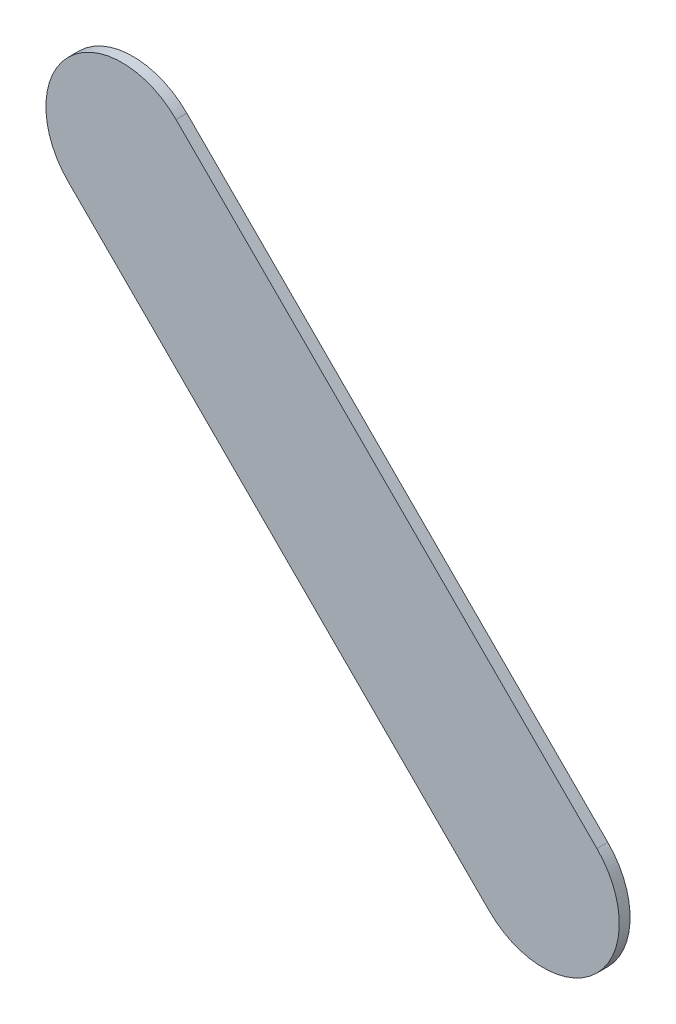
ISO-10303-21;
HEADER;
FILE_DESCRIPTION(('STEP AP214'),'2;1');
FILE_NAME('part.step','',(''),(''),'','','');
FILE_SCHEMA(('AUTOMOTIVE_DESIGN { 1 0 10303 214 1 1 1 1 }'));
ENDSEC;
DATA;
#1=APPLICATION_CONTEXT('core data for automotive mechanical design processes');
#2=APPLICATION_PROTOCOL_DEFINITION('international standard','automotive_design',2000,#1);
#3=PRODUCT_CONTEXT('',#1,'mechanical');
#4=PRODUCT('Part','Part','',(#3));
#5=PRODUCT_RELATED_PRODUCT_CATEGORY('part','',(#4));
#6=PRODUCT_DEFINITION_FORMATION('','',#4);
#7=PRODUCT_DEFINITION_CONTEXT('part definition',#1,'design');
#8=PRODUCT_DEFINITION('design','',#6,#7);
#9=PRODUCT_DEFINITION_SHAPE('','',#8);
#10=(LENGTH_UNIT() NAMED_UNIT(*) SI_UNIT(.MILLI.,.METRE.));
#11=(NAMED_UNIT(*) PLANE_ANGLE_UNIT() SI_UNIT($,.RADIAN.));
#12=(NAMED_UNIT(*) SI_UNIT($,.STERADIAN.) SOLID_ANGLE_UNIT());
#13=UNCERTAINTY_MEASURE_WITH_UNIT(LENGTH_MEASURE(1.E-05),#10,'distance_accuracy_value','');
#14=(GEOMETRIC_REPRESENTATION_CONTEXT(3) GLOBAL_UNCERTAINTY_ASSIGNED_CONTEXT((#13)) GLOBAL_UNIT_ASSIGNED_CONTEXT((#10,
#11,#12)) REPRESENTATION_CONTEXT('',''));
#15=CARTESIAN_POINT('',(0.,0.,0.));
#16=DIRECTION('',(0.,0.,1.));
#17=DIRECTION('',(1.,0.,0.));
#18=AXIS2_PLACEMENT_3D('',#15,#16,#17);
#19=CARTESIAN_POINT('',(51.10121352,107.94523496,0.));
#20=DIRECTION('',(0.707106781186538,0.707106781186557,0.));
#21=DIRECTION('',(0.707106781186557,-0.707106781186538,0.));
#22=AXIS2_PLACEMENT_3D('',#19,#20,#21);
#23=PLANE('',#22);
#24=DIRECTION('',(0.707106781186557,-0.707106781186538,0.));
#25=VECTOR('',#24,1.);
#26=CARTESIAN_POINT('',(51.10121352,107.94523496,0.03556));
#27=LINE('',#26,#25);
#28=CARTESIAN_POINT('',(51.10121352,107.94523496,0.03556));
#29=VERTEX_POINT('',#28);
#30=CARTESIAN_POINT('',(52.48222676,106.56422172,0.03556));
#31=VERTEX_POINT('',#30);
#32=EDGE_CURVE('E11',#29,#31,#27,.T.);
#33=ORIENTED_EDGE('',*,*,#32,.F.);
#34=DIRECTION('',(0.,0.,1.));
#35=VECTOR('',#34,1.);
#36=CARTESIAN_POINT('',(51.10121352,107.94523496,0.));
#37=LINE('',#36,#35);
#38=CARTESIAN_POINT('',(51.10121352,107.94523496,0.));
#39=VERTEX_POINT('',#38);
#40=EDGE_CURVE('E24',#39,#29,#37,.T.);
#41=ORIENTED_EDGE('',*,*,#40,.F.);
#42=DIRECTION('',(0.707106781186557,-0.707106781186538,0.));
#43=VECTOR('',#42,1.);
#44=CARTESIAN_POINT('',(51.10121352,107.94523496,0.));
#45=LINE('',#44,#43);
#46=CARTESIAN_POINT('',(52.48222676,106.56422172,0.));
#47=VERTEX_POINT('',#46);
#48=EDGE_CURVE('E75',#39,#47,#45,.T.);
#49=ORIENTED_EDGE('',*,*,#48,.T.);
#50=DIRECTION('',(0.,0.,1.));
#51=VECTOR('',#50,1.);
#52=CARTESIAN_POINT('',(52.48222676,106.56422172,0.));
#53=LINE('',#52,#51);
#54=EDGE_CURVE('E37',#47,#31,#53,.T.);
#55=ORIENTED_EDGE('',*,*,#54,.T.);
#56=EDGE_LOOP('',(#33,#41,#49,#55));
#57=FACE_BOUND('',#56,.T.);
#58=ADVANCED_FACE('F17',(#57),#23,.F.);
#59=CARTESIAN_POINT('',(52.65900314,106.7409981,0.));
#60=DIRECTION('',(0.,0.,-1.));
#61=DIRECTION('',(-0.707106781186519,-0.707106781186576,0.));
#62=AXIS2_PLACEMENT_3D('',#59,#60,#61);
#63=CYLINDRICAL_SURFACE('',#62,0.24999955410322);
#64=CARTESIAN_POINT('',(52.65900314,106.7409981,0.03556));
#65=DIRECTION('',(0.,0.,1.));
#66=DIRECTION('',(-0.707106781186519,-0.707106781186576,0.));
#67=AXIS2_PLACEMENT_3D('',#64,#65,#66);
#68=CIRCLE('',#67,0.24999955410322);
#69=CARTESIAN_POINT('',(52.83577952,106.91777448,0.03556));
#70=VERTEX_POINT('',#69);
#71=EDGE_CURVE('E83',#31,#70,#68,.T.);
#72=ORIENTED_EDGE('',*,*,#71,.F.);
#73=ORIENTED_EDGE('',*,*,#54,.F.);
#74=CARTESIAN_POINT('',(52.65900314,106.7409981,0.));
#75=DIRECTION('',(0.,0.,1.));
#76=DIRECTION('',(-0.707106781186519,-0.707106781186576,0.));
#77=AXIS2_PLACEMENT_3D('',#74,#75,#76);
#78=CIRCLE('',#77,0.24999955410322);
#79=CARTESIAN_POINT('',(52.83577952,106.91777448,0.));
#80=VERTEX_POINT('',#79);
#81=EDGE_CURVE('E81',#47,#80,#78,.T.);
#82=ORIENTED_EDGE('',*,*,#81,.T.);
#83=DIRECTION('',(0.,0.,1.));
#84=VECTOR('',#83,1.);
#85=CARTESIAN_POINT('',(52.83577952,106.91777448,0.));
#86=LINE('',#85,#84);
#87=EDGE_CURVE('E67',#80,#70,#86,.T.);
#88=ORIENTED_EDGE('',*,*,#87,.T.);
#89=EDGE_LOOP('',(#72,#73,#82,#88));
#90=FACE_BOUND('',#89,.T.);
#91=ADVANCED_FACE('F89',(#90),#63,.T.);
#92=CARTESIAN_POINT('',(52.83577952,106.91777448,0.));
#93=DIRECTION('',(-0.707106781186546,-0.707106781186549,0.));
#94=DIRECTION('',(-0.707106781186549,0.707106781186546,0.));
#95=AXIS2_PLACEMENT_3D('',#92,#93,#94);
#96=PLANE('',#95);
#97=DIRECTION('',(-0.707106781186549,0.707106781186546,0.));
#98=VECTOR('',#97,1.);
#99=CARTESIAN_POINT('',(52.83577952,106.91777448,0.03556));
#100=LINE('',#99,#98);
#101=CARTESIAN_POINT('',(51.45476628,108.29878772,0.03556));
#102=VERTEX_POINT('',#101);
#103=EDGE_CURVE('E71',#70,#102,#100,.T.);
#104=ORIENTED_EDGE('',*,*,#103,.F.);
#105=ORIENTED_EDGE('',*,*,#87,.F.);
#106=DIRECTION('',(-0.707106781186549,0.707106781186546,0.));
#107=VECTOR('',#106,1.);
#108=CARTESIAN_POINT('',(52.83577952,106.91777448,0.));
#109=LINE('',#108,#107);
#110=CARTESIAN_POINT('',(51.45476628,108.29878772,0.));
#111=VERTEX_POINT('',#110);
#112=EDGE_CURVE('E63',#80,#111,#109,.T.);
#113=ORIENTED_EDGE('',*,*,#112,.T.);
#114=DIRECTION('',(0.,0.,1.));
#115=VECTOR('',#114,1.);
#116=CARTESIAN_POINT('',(51.45476628,108.29878772,0.));
#117=LINE('',#116,#115);
#118=EDGE_CURVE('E53',#111,#102,#117,.T.);
#119=ORIENTED_EDGE('',*,*,#118,.T.);
#120=EDGE_LOOP('',(#104,#105,#113,#119));
#121=FACE_BOUND('',#120,.T.);
#122=ADVANCED_FACE('F66',(#121),#96,.F.);
#123=CARTESIAN_POINT('',(51.2779899,108.12201134,0.));
#124=DIRECTION('',(0.,0.,-1.));
#125=DIRECTION('',(0.707106781186548,0.707106781186548,0.));
#126=AXIS2_PLACEMENT_3D('',#123,#124,#125);
#127=CYLINDRICAL_SURFACE('',#126,0.249999554103226);
#128=CARTESIAN_POINT('',(51.2779899,108.12201134,0.03556));
#129=DIRECTION('',(0.,0.,1.));
#130=DIRECTION('',(0.707106781186548,0.707106781186548,0.));
#131=AXIS2_PLACEMENT_3D('',#128,#129,#130);
#132=CIRCLE('',#131,0.249999554103226);
#133=EDGE_CURVE('E59',#102,#29,#132,.T.);
#134=ORIENTED_EDGE('',*,*,#133,.F.);
#135=ORIENTED_EDGE('',*,*,#118,.F.);
#136=CARTESIAN_POINT('',(51.2779899,108.12201134,0.));
#137=DIRECTION('',(0.,0.,1.));
#138=DIRECTION('',(0.707106781186548,0.707106781186548,0.));
#139=AXIS2_PLACEMENT_3D('',#136,#137,#138);
#140=CIRCLE('',#139,0.249999554103226);
#141=EDGE_CURVE('E57',#111,#39,#140,.T.);
#142=ORIENTED_EDGE('',*,*,#141,.T.);
#143=ORIENTED_EDGE('',*,*,#40,.T.);
#144=EDGE_LOOP('',(#134,#135,#142,#143));
#145=FACE_BOUND('',#144,.T.);
#146=ADVANCED_FACE('F55',(#145),#127,.T.);
#147=CARTESIAN_POINT('',(51.10121352,107.94523496,0.));
#148=DIRECTION('',(0.,0.,-1.));
#149=DIRECTION('',(-1.,0.,0.));
#150=AXIS2_PLACEMENT_3D('',#147,#148,#149);
#151=PLANE('',#150);
#152=ORIENTED_EDGE('',*,*,#141,.F.);
#153=ORIENTED_EDGE('',*,*,#112,.F.);
#154=ORIENTED_EDGE('',*,*,#81,.F.);
#155=ORIENTED_EDGE('',*,*,#48,.F.);
#156=EDGE_LOOP('',(#152,#153,#154,#155));
#157=FACE_BOUND('',#156,.T.);
#158=ADVANCED_FACE('F74',(#157),#151,.T.);
#159=CARTESIAN_POINT('',(51.10121352,107.94523496,0.03556));
#160=DIRECTION('',(0.,0.,-1.));
#161=DIRECTION('',(-1.,0.,0.));
#162=AXIS2_PLACEMENT_3D('',#159,#160,#161);
#163=PLANE('',#162);
#164=ORIENTED_EDGE('',*,*,#32,.T.);
#165=ORIENTED_EDGE('',*,*,#71,.T.);
#166=ORIENTED_EDGE('',*,*,#103,.T.);
#167=ORIENTED_EDGE('',*,*,#133,.T.);
#168=EDGE_LOOP('',(#164,#165,#166,#167));
#169=FACE_BOUND('',#168,.T.);
#170=ADVANCED_FACE('F91',(#169),#163,.F.);
#171=CLOSED_SHELL('',(#58,#91,#122,#146,#158,#170));
#172=MANIFOLD_SOLID_BREP('B1',#171);
#173=ADVANCED_BREP_SHAPE_REPRESENTATION('',(#18,#172),#14);
#174=SHAPE_DEFINITION_REPRESENTATION(#9,#173);
ENDSEC;
END-ISO-10303-21;
